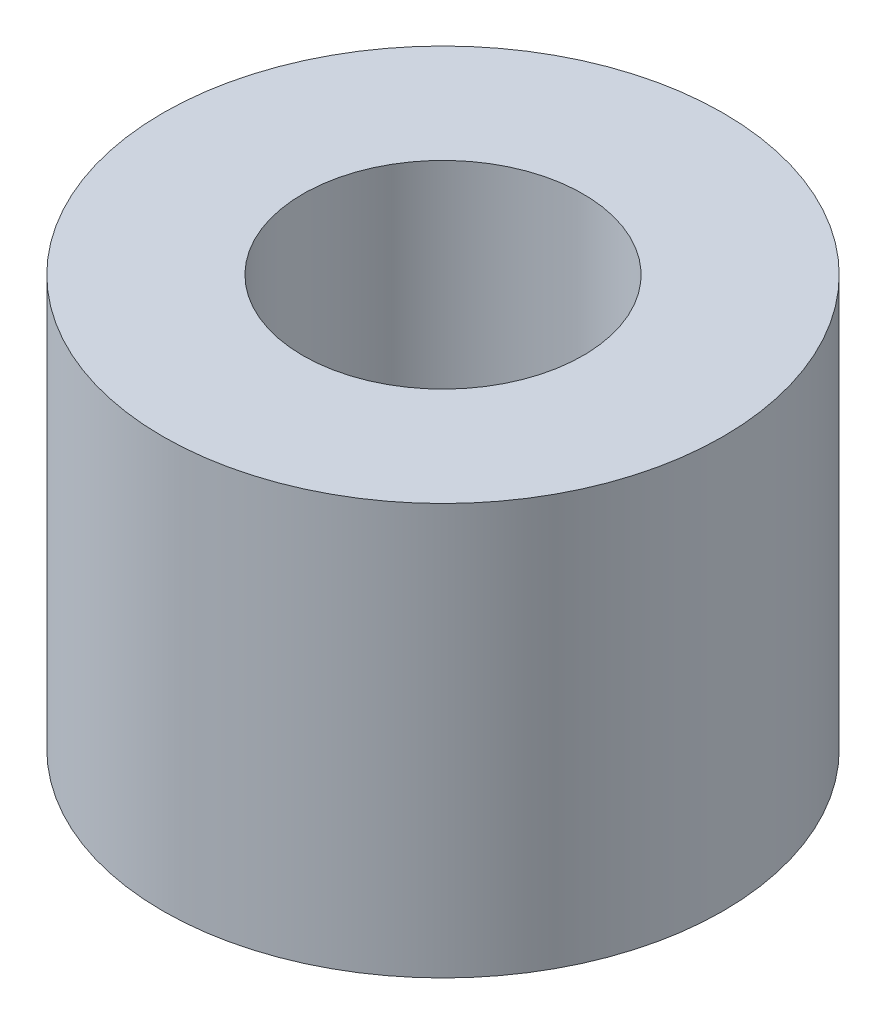
ISO-10303-21;
HEADER;
FILE_DESCRIPTION(('STEP AP214'),'2;1');
FILE_NAME('part.step','',(''),(''),'','','');
FILE_SCHEMA(('AUTOMOTIVE_DESIGN { 1 0 10303 214 1 1 1 1 }'));
ENDSEC;
DATA;
#1=APPLICATION_CONTEXT('core data for automotive mechanical design processes');
#2=APPLICATION_PROTOCOL_DEFINITION('international standard','automotive_design',2000,#1);
#3=PRODUCT_CONTEXT('',#1,'mechanical');
#4=PRODUCT('Part','Part','',(#3));
#5=PRODUCT_RELATED_PRODUCT_CATEGORY('part','',(#4));
#6=PRODUCT_DEFINITION_FORMATION('','',#4);
#7=PRODUCT_DEFINITION_CONTEXT('part definition',#1,'design');
#8=PRODUCT_DEFINITION('design','',#6,#7);
#9=PRODUCT_DEFINITION_SHAPE('','',#8);
#10=(LENGTH_UNIT() NAMED_UNIT(*) SI_UNIT(.MILLI.,.METRE.));
#11=(NAMED_UNIT(*) PLANE_ANGLE_UNIT() SI_UNIT($,.RADIAN.));
#12=(NAMED_UNIT(*) SI_UNIT($,.STERADIAN.) SOLID_ANGLE_UNIT());
#13=UNCERTAINTY_MEASURE_WITH_UNIT(LENGTH_MEASURE(1.E-05),#10,'distance_accuracy_value','');
#14=(GEOMETRIC_REPRESENTATION_CONTEXT(3) GLOBAL_UNCERTAINTY_ASSIGNED_CONTEXT((#13)) GLOBAL_UNIT_ASSIGNED_CONTEXT((#10,
#11,#12)) REPRESENTATION_CONTEXT('',''));
#15=CARTESIAN_POINT('',(0.,0.,0.));
#16=DIRECTION('',(0.,0.,1.));
#17=DIRECTION('',(1.,0.,0.));
#18=AXIS2_PLACEMENT_3D('',#15,#16,#17);
#19=CARTESIAN_POINT('',(3.08506617435395,7.88070483223529,16.5));
#20=DIRECTION('',(0.,1.,0.));
#21=DIRECTION('',(0.,0.,1.));
#22=AXIS2_PLACEMENT_3D('',#19,#20,#21);
#23=CYLINDRICAL_SURFACE('',#22,0.75);
#24=CARTESIAN_POINT('',(3.08506617435395,10.0807048322353,16.5));
#25=DIRECTION('',(0.,1.,0.));
#26=DIRECTION('',(0.,0.,1.));
#27=AXIS2_PLACEMENT_3D('',#24,#25,#26);
#28=CIRCLE('',#27,0.75);
#29=CARTESIAN_POINT('',(3.08506617435395,10.0807048322353,17.25));
#30=VERTEX_POINT('',#29);
#31=EDGE_CURVE('E26',#30,#30,#28,.F.);
#32=ORIENTED_EDGE('',*,*,#31,.F.);
#33=EDGE_LOOP('',(#32));
#34=FACE_BOUND('',#33,.T.);
#35=CARTESIAN_POINT('',(3.08506617435395,7.88070483223529,16.5));
#36=DIRECTION('',(0.,1.,0.));
#37=DIRECTION('',(0.,0.,1.));
#38=AXIS2_PLACEMENT_3D('',#35,#36,#37);
#39=CIRCLE('',#38,0.75);
#40=CARTESIAN_POINT('',(3.08506617435395,7.88070483223529,17.25));
#41=VERTEX_POINT('',#40);
#42=EDGE_CURVE('E17',#41,#41,#39,.F.);
#43=ORIENTED_EDGE('',*,*,#42,.T.);
#44=EDGE_LOOP('',(#43));
#45=FACE_BOUND('',#44,.T.);
#46=ADVANCED_FACE('F14',(#34,#45),#23,.F.);
#47=CARTESIAN_POINT('',(3.08506617435395,7.88070483223529,16.5));
#48=DIRECTION('',(0.,1.,0.));
#49=DIRECTION('',(0.,0.,1.));
#50=AXIS2_PLACEMENT_3D('',#47,#48,#49);
#51=PLANE('',#50);
#52=ORIENTED_EDGE('',*,*,#42,.F.);
#53=EDGE_LOOP('',(#52));
#54=FACE_BOUND('',#53,.T.);
#55=CARTESIAN_POINT('',(3.08506617435395,7.88070483223529,16.5));
#56=DIRECTION('',(0.,-1.,0.));
#57=DIRECTION('',(0.,0.,-1.));
#58=AXIS2_PLACEMENT_3D('',#55,#56,#57);
#59=CIRCLE('',#58,1.5);
#60=CARTESIAN_POINT('',(3.08506617435395,7.88070483223529,15.));
#61=VERTEX_POINT('',#60);
#62=EDGE_CURVE('E21',#61,#61,#59,.F.);
#63=ORIENTED_EDGE('',*,*,#62,.F.);
#64=EDGE_LOOP('',(#63));
#65=FACE_BOUND('',#64,.T.);
#66=ADVANCED_FACE('F35',(#54,#65),#51,.F.);
#67=CARTESIAN_POINT('',(3.08506617435395,10.0807048322353,16.5));
#68=DIRECTION('',(0.,1.,0.));
#69=DIRECTION('',(0.,0.,1.));
#70=AXIS2_PLACEMENT_3D('',#67,#68,#69);
#71=PLANE('',#70);
#72=ORIENTED_EDGE('',*,*,#31,.T.);
#73=EDGE_LOOP('',(#72));
#74=FACE_BOUND('',#73,.T.);
#75=CARTESIAN_POINT('',(3.08506617435395,10.0807048322353,16.5));
#76=DIRECTION('',(0.,-1.,0.));
#77=DIRECTION('',(0.,0.,-1.));
#78=AXIS2_PLACEMENT_3D('',#75,#76,#77);
#79=CIRCLE('',#78,1.5);
#80=CARTESIAN_POINT('',(3.08506617435395,10.0807048322353,15.));
#81=VERTEX_POINT('',#80);
#82=EDGE_CURVE('E10',#81,#81,#79,.T.);
#83=ORIENTED_EDGE('',*,*,#82,.F.);
#84=EDGE_LOOP('',(#83));
#85=FACE_BOUND('',#84,.T.);
#86=ADVANCED_FACE('F38',(#74,#85),#71,.T.);
#87=CARTESIAN_POINT('',(3.08506617435395,10.0807048322353,16.5));
#88=DIRECTION('',(0.,-1.,0.));
#89=DIRECTION('',(0.,0.,-1.));
#90=AXIS2_PLACEMENT_3D('',#87,#88,#89);
#91=CYLINDRICAL_SURFACE('',#90,1.5);
#92=ORIENTED_EDGE('',*,*,#82,.T.);
#93=EDGE_LOOP('',(#92));
#94=FACE_BOUND('',#93,.T.);
#95=ORIENTED_EDGE('',*,*,#62,.T.);
#96=EDGE_LOOP('',(#95));
#97=FACE_BOUND('',#96,.T.);
#98=ADVANCED_FACE('F41',(#94,#97),#91,.T.);
#99=CLOSED_SHELL('',(#46,#66,#86,#98));
#100=MANIFOLD_SOLID_BREP('B1',#99);
#101=ADVANCED_BREP_SHAPE_REPRESENTATION('',(#18,#100),#14);
#102=SHAPE_DEFINITION_REPRESENTATION(#9,#101);
ENDSEC;
END-ISO-10303-21;
